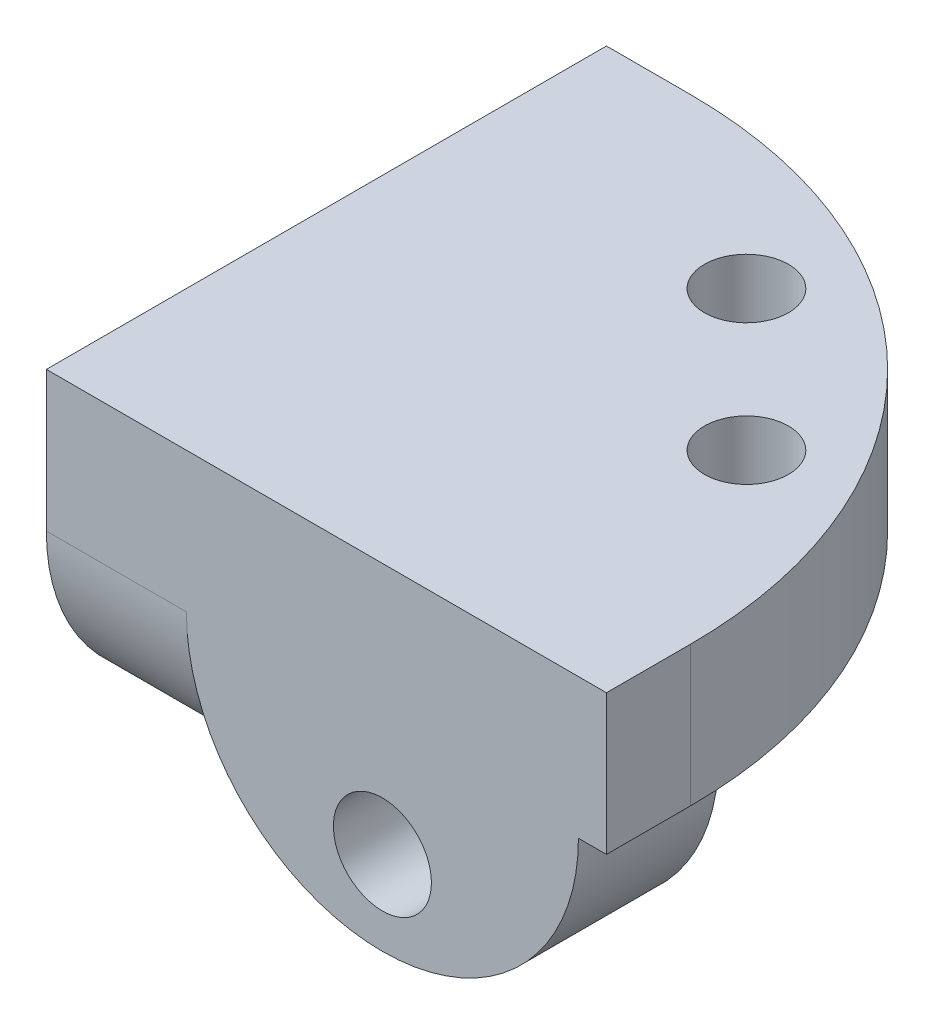
ISO-10303-21;
HEADER;
FILE_DESCRIPTION(('STEP AP214'),'2;1');
FILE_NAME('part.step','',(''),(''),'','','');
FILE_SCHEMA(('AUTOMOTIVE_DESIGN { 1 0 10303 214 1 1 1 1 }'));
ENDSEC;
DATA;
#1=APPLICATION_CONTEXT('core data for automotive mechanical design processes');
#2=APPLICATION_PROTOCOL_DEFINITION('international standard','automotive_design',2000,#1);
#3=PRODUCT_CONTEXT('',#1,'mechanical');
#4=PRODUCT('Part','Part','',(#3));
#5=PRODUCT_RELATED_PRODUCT_CATEGORY('part','',(#4));
#6=PRODUCT_DEFINITION_FORMATION('','',#4);
#7=PRODUCT_DEFINITION_CONTEXT('part definition',#1,'design');
#8=PRODUCT_DEFINITION('design','',#6,#7);
#9=PRODUCT_DEFINITION_SHAPE('','',#8);
#10=(LENGTH_UNIT() NAMED_UNIT(*) SI_UNIT(.MILLI.,.METRE.));
#11=(NAMED_UNIT(*) PLANE_ANGLE_UNIT() SI_UNIT($,.RADIAN.));
#12=(NAMED_UNIT(*) SI_UNIT($,.STERADIAN.) SOLID_ANGLE_UNIT());
#13=UNCERTAINTY_MEASURE_WITH_UNIT(LENGTH_MEASURE(1.E-05),#10,'distance_accuracy_value','');
#14=(GEOMETRIC_REPRESENTATION_CONTEXT(3) GLOBAL_UNCERTAINTY_ASSIGNED_CONTEXT((#13)) GLOBAL_UNIT_ASSIGNED_CONTEXT((#10,
#11,#12)) REPRESENTATION_CONTEXT('',''));
#15=CARTESIAN_POINT('',(0.,0.,0.));
#16=DIRECTION('',(0.,0.,1.));
#17=DIRECTION('',(1.,0.,0.));
#18=AXIS2_PLACEMENT_3D('',#15,#16,#17);
#19=CARTESIAN_POINT('',(0.,5.,0.));
#20=DIRECTION('',(0.,-1.,0.));
#21=DIRECTION('',(0.,0.,-1.));
#22=AXIS2_PLACEMENT_3D('',#19,#20,#21);
#23=PLANE('',#22);
#24=DIRECTION('',(0.,0.,-1.));
#25=VECTOR('',#24,1.);
#26=CARTESIAN_POINT('',(20.,5.,0.));
#27=LINE('',#26,#25);
#28=CARTESIAN_POINT('',(20.,5.,0.));
#29=VERTEX_POINT('',#28);
#30=CARTESIAN_POINT('',(20.,5.,-3.));
#31=VERTEX_POINT('',#30);
#32=EDGE_CURVE('E161',#29,#31,#27,.T.);
#33=ORIENTED_EDGE('',*,*,#32,.T.);
#34=CARTESIAN_POINT('',(3.,5.,-3.));
#35=DIRECTION('',(0.,-1.,0.));
#36=DIRECTION('',(0.,0.,-1.));
#37=AXIS2_PLACEMENT_3D('',#34,#35,#36);
#38=CIRCLE('',#37,17.);
#39=CARTESIAN_POINT('',(3.,5.,-20.));
#40=VERTEX_POINT('',#39);
#41=EDGE_CURVE('E11',#31,#40,#38,.F.);
#42=ORIENTED_EDGE('',*,*,#41,.T.);
#43=DIRECTION('',(-1.,0.,0.));
#44=VECTOR('',#43,1.);
#45=CARTESIAN_POINT('',(0.,5.,-20.));
#46=LINE('',#45,#44);
#47=CARTESIAN_POINT('',(0.,5.,-20.));
#48=VERTEX_POINT('',#47);
#49=EDGE_CURVE('E163',#40,#48,#46,.T.);
#50=ORIENTED_EDGE('',*,*,#49,.T.);
#51=DIRECTION('',(0.,0.,1.));
#52=VECTOR('',#51,1.);
#53=CARTESIAN_POINT('',(0.,5.,0.));
#54=LINE('',#53,#52);
#55=CARTESIAN_POINT('',(0.,5.,0.));
#56=VERTEX_POINT('',#55);
#57=EDGE_CURVE('E155',#48,#56,#54,.T.);
#58=ORIENTED_EDGE('',*,*,#57,.T.);
#59=DIRECTION('',(1.,0.,0.));
#60=VECTOR('',#59,1.);
#61=CARTESIAN_POINT('',(0.,5.,0.));
#62=LINE('',#61,#60);
#63=EDGE_CURVE('E158',#56,#29,#62,.T.);
#64=ORIENTED_EDGE('',*,*,#63,.T.);
#65=EDGE_LOOP('',(#33,#42,#50,#58,#64));
#66=FACE_BOUND('',#65,.T.);
#67=CARTESIAN_POINT('',(10.,5.,-15.));
#68=DIRECTION('',(0.,1.,0.));
#69=DIRECTION('',(0.,0.,1.));
#70=AXIS2_PLACEMENT_3D('',#67,#68,#69);
#71=CIRCLE('',#70,1.5);
#72=CARTESIAN_POINT('',(10.,5.,-13.5));
#73=VERTEX_POINT('',#72);
#74=EDGE_CURVE('E149',#73,#73,#71,.T.);
#75=ORIENTED_EDGE('',*,*,#74,.F.);
#76=EDGE_LOOP('',(#75));
#77=FACE_BOUND('',#76,.T.);
#78=CARTESIAN_POINT('',(15.,5.,-10.));
#79=DIRECTION('',(0.,1.,0.));
#80=DIRECTION('',(0.,0.,1.));
#81=AXIS2_PLACEMENT_3D('',#78,#79,#80);
#82=CIRCLE('',#81,1.5);
#83=CARTESIAN_POINT('',(15.,5.,-8.5));
#84=VERTEX_POINT('',#83);
#85=EDGE_CURVE('E140',#84,#84,#82,.T.);
#86=ORIENTED_EDGE('',*,*,#85,.F.);
#87=EDGE_LOOP('',(#86));
#88=FACE_BOUND('',#87,.T.);
#89=ADVANCED_FACE('F36',(#66,#77,#88),#23,.F.);
#90=CARTESIAN_POINT('',(0.,0.,0.));
#91=DIRECTION('',(0.,-1.,0.));
#92=DIRECTION('',(0.,0.,-1.));
#93=AXIS2_PLACEMENT_3D('',#90,#91,#92);
#94=PLANE('',#93);
#95=DIRECTION('',(-1.,0.,0.));
#96=VECTOR('',#95,1.);
#97=CARTESIAN_POINT('',(0.,0.,-20.));
#98=LINE('',#97,#96);
#99=CARTESIAN_POINT('',(3.,0.,-20.));
#100=VERTEX_POINT('',#99);
#101=CARTESIAN_POINT('',(0.,0.,-20.));
#102=VERTEX_POINT('',#101);
#103=EDGE_CURVE('E159',#100,#102,#98,.T.);
#104=ORIENTED_EDGE('',*,*,#103,.F.);
#105=CARTESIAN_POINT('',(3.,0.,-3.));
#106=DIRECTION('',(0.,-1.,0.));
#107=DIRECTION('',(0.,0.,-1.));
#108=AXIS2_PLACEMENT_3D('',#105,#106,#107);
#109=CIRCLE('',#108,17.);
#110=CARTESIAN_POINT('',(20.,0.,-3.));
#111=VERTEX_POINT('',#110);
#112=EDGE_CURVE('E58',#100,#111,#109,.T.);
#113=ORIENTED_EDGE('',*,*,#112,.T.);
#114=DIRECTION('',(0.,0.,-1.));
#115=VECTOR('',#114,1.);
#116=CARTESIAN_POINT('',(20.,0.,0.));
#117=LINE('',#116,#115);
#118=CARTESIAN_POINT('',(20.,0.,0.));
#119=VERTEX_POINT('',#118);
#120=EDGE_CURVE('E112',#119,#111,#117,.T.);
#121=ORIENTED_EDGE('',*,*,#120,.F.);
#122=DIRECTION('',(1.,0.,0.));
#123=VECTOR('',#122,1.);
#124=CARTESIAN_POINT('',(0.,0.,0.));
#125=LINE('',#124,#123);
#126=CARTESIAN_POINT('',(19.,0.,0.));
#127=VERTEX_POINT('',#126);
#128=EDGE_CURVE('E113',#127,#119,#125,.T.);
#129=ORIENTED_EDGE('',*,*,#128,.F.);
#130=DIRECTION('',(0.,0.,1.));
#131=VECTOR('',#130,1.);
#132=CARTESIAN_POINT('',(19.,0.,-5.));
#133=LINE('',#132,#131);
#134=CARTESIAN_POINT('',(19.,0.,-5.));
#135=VERTEX_POINT('',#134);
#136=EDGE_CURVE('E121',#135,#127,#133,.T.);
#137=ORIENTED_EDGE('',*,*,#136,.F.);
#138=DIRECTION('',(-1.,0.,0.));
#139=VECTOR('',#138,1.);
#140=CARTESIAN_POINT('',(19.,0.,-5.));
#141=LINE('',#140,#139);
#142=CARTESIAN_POINT('',(5.,0.,-5.));
#143=VERTEX_POINT('',#142);
#144=EDGE_CURVE('E142',#135,#143,#141,.T.);
#145=ORIENTED_EDGE('',*,*,#144,.T.);
#146=DIRECTION('',(0.,0.,-1.));
#147=VECTOR('',#146,1.);
#148=CARTESIAN_POINT('',(5.,0.,0.));
#149=LINE('',#148,#147);
#150=CARTESIAN_POINT('',(5.,0.,-14.));
#151=VERTEX_POINT('',#150);
#152=EDGE_CURVE('E133',#143,#151,#149,.T.);
#153=ORIENTED_EDGE('',*,*,#152,.T.);
#154=DIRECTION('',(-1.,0.,0.));
#155=VECTOR('',#154,1.);
#156=CARTESIAN_POINT('',(5.,0.,-14.));
#157=LINE('',#156,#155);
#158=CARTESIAN_POINT('',(0.,0.,-14.));
#159=VERTEX_POINT('',#158);
#160=EDGE_CURVE('E130',#151,#159,#157,.T.);
#161=ORIENTED_EDGE('',*,*,#160,.T.);
#162=DIRECTION('',(0.,0.,1.));
#163=VECTOR('',#162,1.);
#164=CARTESIAN_POINT('',(0.,0.,0.));
#165=LINE('',#164,#163);
#166=EDGE_CURVE('E152',#102,#159,#165,.T.);
#167=ORIENTED_EDGE('',*,*,#166,.F.);
#168=EDGE_LOOP('',(#104,#113,#121,#129,#137,#145,#153,#161,#167));
#169=FACE_BOUND('',#168,.T.);
#170=CARTESIAN_POINT('',(10.,0.,-15.));
#171=DIRECTION('',(0.,1.,0.));
#172=DIRECTION('',(0.,0.,1.));
#173=AXIS2_PLACEMENT_3D('',#170,#171,#172);
#174=CIRCLE('',#173,1.5);
#175=CARTESIAN_POINT('',(10.,0.,-13.5));
#176=VERTEX_POINT('',#175);
#177=EDGE_CURVE('E147',#176,#176,#174,.T.);
#178=ORIENTED_EDGE('',*,*,#177,.T.);
#179=EDGE_LOOP('',(#178));
#180=FACE_BOUND('',#179,.T.);
#181=CARTESIAN_POINT('',(15.,0.,-10.));
#182=DIRECTION('',(0.,1.,0.));
#183=DIRECTION('',(0.,0.,1.));
#184=AXIS2_PLACEMENT_3D('',#181,#182,#183);
#185=CIRCLE('',#184,1.5);
#186=CARTESIAN_POINT('',(15.,0.,-8.5));
#187=VERTEX_POINT('',#186);
#188=EDGE_CURVE('E137',#187,#187,#185,.T.);
#189=ORIENTED_EDGE('',*,*,#188,.T.);
#190=EDGE_LOOP('',(#189));
#191=FACE_BOUND('',#190,.T.);
#192=ADVANCED_FACE('F187',(#169,#180,#191),#94,.T.);
#193=CARTESIAN_POINT('',(0.,5.,0.));
#194=DIRECTION('',(1.,0.,0.));
#195=DIRECTION('',(0.,0.,-1.));
#196=AXIS2_PLACEMENT_3D('',#193,#194,#195);
#197=PLANE('',#196);
#198=ORIENTED_EDGE('',*,*,#166,.T.);
#199=CARTESIAN_POINT('',(0.,0.,-7.));
#200=DIRECTION('',(-1.,0.,0.));
#201=DIRECTION('',(0.,0.,-1.));
#202=AXIS2_PLACEMENT_3D('',#199,#200,#201);
#203=CIRCLE('',#202,7.);
#204=CARTESIAN_POINT('',(0.,0.,0.));
#205=VERTEX_POINT('',#204);
#206=EDGE_CURVE('E134',#159,#205,#203,.T.);
#207=ORIENTED_EDGE('',*,*,#206,.T.);
#208=DIRECTION('',(0.,-1.,0.));
#209=VECTOR('',#208,1.);
#210=CARTESIAN_POINT('',(0.,5.,0.));
#211=LINE('',#210,#209);
#212=EDGE_CURVE('E107',#56,#205,#211,.T.);
#213=ORIENTED_EDGE('',*,*,#212,.F.);
#214=ORIENTED_EDGE('',*,*,#57,.F.);
#215=DIRECTION('',(0.,-1.,0.));
#216=VECTOR('',#215,1.);
#217=CARTESIAN_POINT('',(0.,5.,-20.));
#218=LINE('',#217,#216);
#219=EDGE_CURVE('E165',#48,#102,#218,.T.);
#220=ORIENTED_EDGE('',*,*,#219,.T.);
#221=EDGE_LOOP('',(#198,#207,#213,#214,#220));
#222=FACE_BOUND('',#221,.T.);
#223=CARTESIAN_POINT('',(0.,-4.,-7.));
#224=DIRECTION('',(-1.,0.,0.));
#225=DIRECTION('',(0.,0.,1.));
#226=AXIS2_PLACEMENT_3D('',#223,#224,#225);
#227=CIRCLE('',#226,1.75);
#228=CARTESIAN_POINT('',(0.,-4.,-5.25));
#229=VERTEX_POINT('',#228);
#230=EDGE_CURVE('E196',#229,#229,#227,.T.);
#231=ORIENTED_EDGE('',*,*,#230,.F.);
#232=EDGE_LOOP('',(#231));
#233=FACE_BOUND('',#232,.T.);
#234=ADVANCED_FACE('F190',(#222,#233),#197,.F.);
#235=CARTESIAN_POINT('',(0.,5.,0.));
#236=DIRECTION('',(0.,0.,-1.));
#237=DIRECTION('',(-1.,0.,0.));
#238=AXIS2_PLACEMENT_3D('',#235,#236,#237);
#239=PLANE('',#238);
#240=CARTESIAN_POINT('',(5.,0.,0.));
#241=VERTEX_POINT('',#240);
#242=EDGE_CURVE('E100',#205,#241,#125,.T.);
#243=ORIENTED_EDGE('',*,*,#242,.T.);
#244=CARTESIAN_POINT('',(12.,0.,0.));
#245=DIRECTION('',(0.,0.,1.));
#246=DIRECTION('',(1.,0.,0.));
#247=AXIS2_PLACEMENT_3D('',#244,#245,#246);
#248=CIRCLE('',#247,7.);
#249=EDGE_CURVE('E104',#241,#127,#248,.T.);
#250=ORIENTED_EDGE('',*,*,#249,.T.);
#251=ORIENTED_EDGE('',*,*,#128,.T.);
#252=DIRECTION('',(0.,-1.,0.));
#253=VECTOR('',#252,1.);
#254=CARTESIAN_POINT('',(20.,5.,0.));
#255=LINE('',#254,#253);
#256=EDGE_CURVE('E172',#29,#119,#255,.T.);
#257=ORIENTED_EDGE('',*,*,#256,.F.);
#258=ORIENTED_EDGE('',*,*,#63,.F.);
#259=ORIENTED_EDGE('',*,*,#212,.T.);
#260=EDGE_LOOP('',(#243,#250,#251,#257,#258,#259));
#261=FACE_BOUND('',#260,.T.);
#262=CARTESIAN_POINT('',(12.,-4.,0.));
#263=DIRECTION('',(0.,0.,1.));
#264=DIRECTION('',(1.,0.,0.));
#265=AXIS2_PLACEMENT_3D('',#262,#263,#264);
#266=CIRCLE('',#265,1.75);
#267=CARTESIAN_POINT('',(13.75,-4.,0.));
#268=VERTEX_POINT('',#267);
#269=EDGE_CURVE('E201',#268,#268,#266,.T.);
#270=ORIENTED_EDGE('',*,*,#269,.F.);
#271=EDGE_LOOP('',(#270));
#272=FACE_BOUND('',#271,.T.);
#273=ADVANCED_FACE('F102',(#261,#272),#239,.F.);
#274=CARTESIAN_POINT('',(20.,5.,0.));
#275=DIRECTION('',(-1.,0.,0.));
#276=DIRECTION('',(0.,0.,1.));
#277=AXIS2_PLACEMENT_3D('',#274,#275,#276);
#278=PLANE('',#277);
#279=ORIENTED_EDGE('',*,*,#120,.T.);
#280=DIRECTION('',(0.,-1.,0.));
#281=VECTOR('',#280,1.);
#282=CARTESIAN_POINT('',(20.,5.,-3.));
#283=LINE('',#282,#281);
#284=EDGE_CURVE('E44',#111,#31,#283,.F.);
#285=ORIENTED_EDGE('',*,*,#284,.T.);
#286=ORIENTED_EDGE('',*,*,#32,.F.);
#287=ORIENTED_EDGE('',*,*,#256,.T.);
#288=EDGE_LOOP('',(#279,#285,#286,#287));
#289=FACE_BOUND('',#288,.T.);
#290=ADVANCED_FACE('F236',(#289),#278,.F.);
#291=CARTESIAN_POINT('',(0.,5.,-20.));
#292=DIRECTION('',(0.,0.,1.));
#293=DIRECTION('',(1.,0.,0.));
#294=AXIS2_PLACEMENT_3D('',#291,#292,#293);
#295=PLANE('',#294);
#296=ORIENTED_EDGE('',*,*,#49,.F.);
#297=DIRECTION('',(0.,-1.,0.));
#298=VECTOR('',#297,1.);
#299=CARTESIAN_POINT('',(3.,5.,-20.));
#300=LINE('',#299,#298);
#301=EDGE_CURVE('E176',#40,#100,#300,.T.);
#302=ORIENTED_EDGE('',*,*,#301,.T.);
#303=ORIENTED_EDGE('',*,*,#103,.T.);
#304=ORIENTED_EDGE('',*,*,#219,.F.);
#305=EDGE_LOOP('',(#296,#302,#303,#304));
#306=FACE_BOUND('',#305,.T.);
#307=ADVANCED_FACE('F182',(#306),#295,.F.);
#308=CARTESIAN_POINT('',(10.,5.,-15.));
#309=DIRECTION('',(0.,-1.,0.));
#310=DIRECTION('',(0.,0.,-1.));
#311=AXIS2_PLACEMENT_3D('',#308,#309,#310);
#312=CYLINDRICAL_SURFACE('',#311,1.5);
#313=ORIENTED_EDGE('',*,*,#74,.T.);
#314=EDGE_LOOP('',(#313));
#315=FACE_BOUND('',#314,.T.);
#316=ORIENTED_EDGE('',*,*,#177,.F.);
#317=EDGE_LOOP('',(#316));
#318=FACE_BOUND('',#317,.T.);
#319=ADVANCED_FACE('F231',(#315,#318),#312,.F.);
#320=CARTESIAN_POINT('',(15.,5.,-10.));
#321=DIRECTION('',(0.,-1.,0.));
#322=DIRECTION('',(0.,0.,-1.));
#323=AXIS2_PLACEMENT_3D('',#320,#321,#322);
#324=CYLINDRICAL_SURFACE('',#323,1.5);
#325=ORIENTED_EDGE('',*,*,#85,.T.);
#326=EDGE_LOOP('',(#325));
#327=FACE_BOUND('',#326,.T.);
#328=ORIENTED_EDGE('',*,*,#188,.F.);
#329=EDGE_LOOP('',(#328));
#330=FACE_BOUND('',#329,.T.);
#331=ADVANCED_FACE('F220',(#327,#330),#324,.F.);
#332=CARTESIAN_POINT('',(12.,0.,-5.));
#333=DIRECTION('',(0.,0.,1.));
#334=DIRECTION('',(1.,0.,0.));
#335=AXIS2_PLACEMENT_3D('',#332,#333,#334);
#336=CYLINDRICAL_SURFACE('',#335,7.);
#337=ORIENTED_EDGE('',*,*,#249,.F.);
#338=DIRECTION('',(0.,0.,1.));
#339=VECTOR('',#338,1.);
#340=CARTESIAN_POINT('',(5.,0.,-5.));
#341=LINE('',#340,#339);
#342=EDGE_CURVE('E118',#143,#241,#341,.T.);
#343=ORIENTED_EDGE('',*,*,#342,.F.);
#344=CARTESIAN_POINT('',(12.,0.,-5.));
#345=DIRECTION('',(0.,0.,1.));
#346=DIRECTION('',(1.,0.,0.));
#347=AXIS2_PLACEMENT_3D('',#344,#345,#346);
#348=CIRCLE('',#347,7.);
#349=EDGE_CURVE('E123',#143,#135,#348,.T.);
#350=ORIENTED_EDGE('',*,*,#349,.T.);
#351=ORIENTED_EDGE('',*,*,#136,.T.);
#352=EDGE_LOOP('',(#337,#343,#350,#351));
#353=FACE_BOUND('',#352,.T.);
#354=ADVANCED_FACE('F116',(#353),#336,.T.);
#355=CARTESIAN_POINT('',(12.,0.,-5.));
#356=DIRECTION('',(0.,0.,1.));
#357=DIRECTION('',(1.,0.,0.));
#358=AXIS2_PLACEMENT_3D('',#355,#356,#357);
#359=PLANE('',#358);
#360=CARTESIAN_POINT('',(12.,-4.,-5.));
#361=DIRECTION('',(0.,0.,1.));
#362=DIRECTION('',(1.,0.,0.));
#363=AXIS2_PLACEMENT_3D('',#360,#361,#362);
#364=CIRCLE('',#363,1.75);
#365=CARTESIAN_POINT('',(13.75,-4.,-5.));
#366=VERTEX_POINT('',#365);
#367=EDGE_CURVE('E124',#366,#366,#364,.T.);
#368=ORIENTED_EDGE('',*,*,#367,.T.);
#369=EDGE_LOOP('',(#368));
#370=FACE_BOUND('',#369,.T.);
#371=ORIENTED_EDGE('',*,*,#349,.F.);
#372=ORIENTED_EDGE('',*,*,#144,.F.);
#373=EDGE_LOOP('',(#371,#372));
#374=FACE_BOUND('',#373,.T.);
#375=ADVANCED_FACE('F209',(#370,#374),#359,.F.);
#376=CARTESIAN_POINT('',(12.,-4.,-5.));
#377=DIRECTION('',(0.,0.,1.));
#378=DIRECTION('',(1.,0.,0.));
#379=AXIS2_PLACEMENT_3D('',#376,#377,#378);
#380=CYLINDRICAL_SURFACE('',#379,1.75);
#381=ORIENTED_EDGE('',*,*,#367,.F.);
#382=EDGE_LOOP('',(#381));
#383=FACE_BOUND('',#382,.T.);
#384=ORIENTED_EDGE('',*,*,#269,.T.);
#385=EDGE_LOOP('',(#384));
#386=FACE_BOUND('',#385,.T.);
#387=ADVANCED_FACE('F211',(#383,#386),#380,.F.);
#388=CARTESIAN_POINT('',(5.,0.,-7.));
#389=DIRECTION('',(-1.,0.,0.));
#390=DIRECTION('',(0.,0.,1.));
#391=AXIS2_PLACEMENT_3D('',#388,#389,#390);
#392=CYLINDRICAL_SURFACE('',#391,7.);
#393=ORIENTED_EDGE('',*,*,#206,.F.);
#394=ORIENTED_EDGE('',*,*,#160,.F.);
#395=CARTESIAN_POINT('',(5.,0.,-7.));
#396=DIRECTION('',(-1.,0.,0.));
#397=DIRECTION('',(0.,0.,-1.));
#398=AXIS2_PLACEMENT_3D('',#395,#396,#397);
#399=CIRCLE('',#398,7.);
#400=EDGE_CURVE('E128',#151,#241,#399,.T.);
#401=ORIENTED_EDGE('',*,*,#400,.T.);
#402=ORIENTED_EDGE('',*,*,#242,.F.);
#403=EDGE_LOOP('',(#393,#394,#401,#402));
#404=FACE_BOUND('',#403,.T.);
#405=ADVANCED_FACE('F129',(#404),#392,.T.);
#406=CARTESIAN_POINT('',(5.,0.,-7.));
#407=DIRECTION('',(1.,0.,0.));
#408=DIRECTION('',(0.,0.,-1.));
#409=AXIS2_PLACEMENT_3D('',#406,#407,#408);
#410=PLANE('',#409);
#411=CARTESIAN_POINT('',(5.,-4.,-7.));
#412=DIRECTION('',(-1.,0.,0.));
#413=DIRECTION('',(0.,0.,1.));
#414=AXIS2_PLACEMENT_3D('',#411,#412,#413);
#415=CIRCLE('',#414,1.75);
#416=CARTESIAN_POINT('',(5.,-4.,-5.25));
#417=VERTEX_POINT('',#416);
#418=EDGE_CURVE('E193',#417,#417,#415,.T.);
#419=ORIENTED_EDGE('',*,*,#418,.T.);
#420=EDGE_LOOP('',(#419));
#421=FACE_BOUND('',#420,.T.);
#422=ORIENTED_EDGE('',*,*,#400,.F.);
#423=ORIENTED_EDGE('',*,*,#152,.F.);
#424=ORIENTED_EDGE('',*,*,#342,.T.);
#425=EDGE_LOOP('',(#422,#423,#424));
#426=FACE_BOUND('',#425,.T.);
#427=ADVANCED_FACE('F136',(#421,#426),#410,.T.);
#428=CARTESIAN_POINT('',(5.,-4.,-7.));
#429=DIRECTION('',(-1.,0.,0.));
#430=DIRECTION('',(0.,0.,1.));
#431=AXIS2_PLACEMENT_3D('',#428,#429,#430);
#432=CYLINDRICAL_SURFACE('',#431,1.75);
#433=ORIENTED_EDGE('',*,*,#418,.F.);
#434=EDGE_LOOP('',(#433));
#435=FACE_BOUND('',#434,.T.);
#436=ORIENTED_EDGE('',*,*,#230,.T.);
#437=EDGE_LOOP('',(#436));
#438=FACE_BOUND('',#437,.T.);
#439=ADVANCED_FACE('F297',(#435,#438),#432,.F.);
#440=CARTESIAN_POINT('',(3.,5.,-3.));
#441=DIRECTION('',(0.,-1.,0.));
#442=DIRECTION('',(0.,0.,-1.));
#443=AXIS2_PLACEMENT_3D('',#440,#441,#442);
#444=CYLINDRICAL_SURFACE('',#443,17.);
#445=ORIENTED_EDGE('',*,*,#41,.F.);
#446=ORIENTED_EDGE('',*,*,#284,.F.);
#447=ORIENTED_EDGE('',*,*,#112,.F.);
#448=ORIENTED_EDGE('',*,*,#301,.F.);
#449=EDGE_LOOP('',(#445,#446,#447,#448));
#450=FACE_BOUND('',#449,.T.);
#451=ADVANCED_FACE('F38',(#450),#444,.T.);
#452=CLOSED_SHELL('',(#89,#192,#234,#273,#290,#307,#319,#331,#354,#375,#387,#405,#427,#439,#451));
#453=MANIFOLD_SOLID_BREP('B2',#452);
#454=ADVANCED_BREP_SHAPE_REPRESENTATION('',(#18,#453),#14);
#455=SHAPE_DEFINITION_REPRESENTATION(#9,#454);
ENDSEC;
END-ISO-10303-21;
